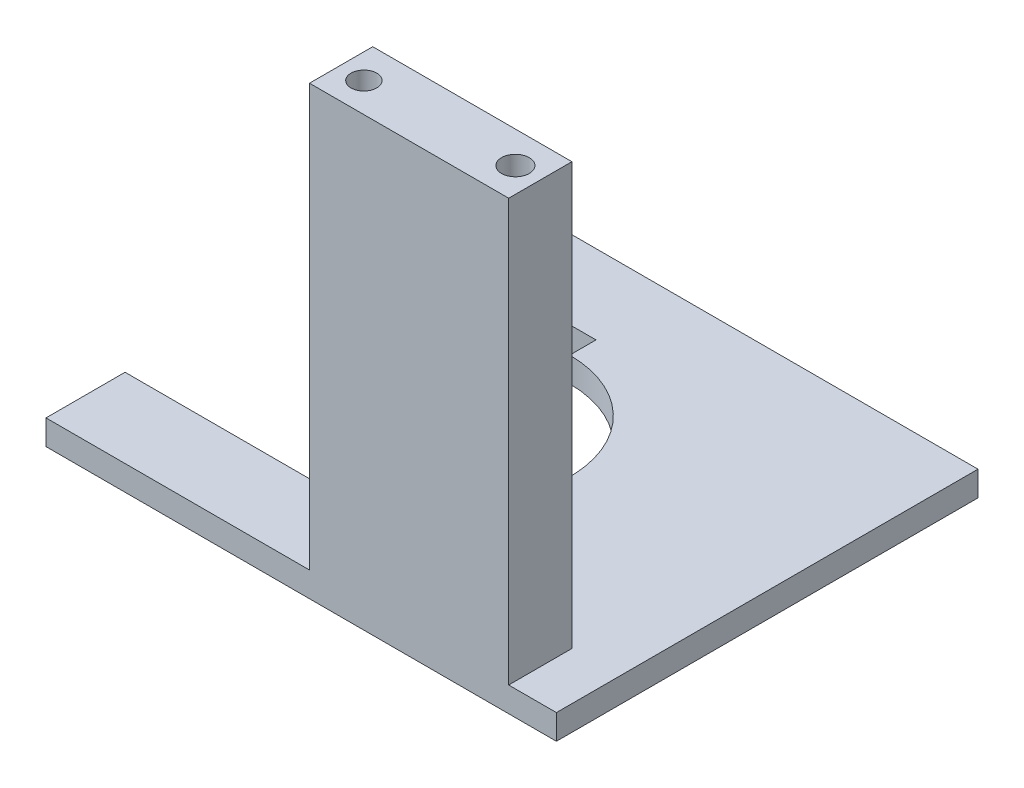
ISO-10303-21;
HEADER;
FILE_DESCRIPTION(('STEP AP214'),'2;1');
FILE_NAME('part.step','',(''),(''),'','','');
FILE_SCHEMA(('AUTOMOTIVE_DESIGN { 1 0 10303 214 1 1 1 1 }'));
ENDSEC;
DATA;
#1=APPLICATION_CONTEXT('core data for automotive mechanical design processes');
#2=APPLICATION_PROTOCOL_DEFINITION('international standard','automotive_design',2000,#1);
#3=PRODUCT_CONTEXT('',#1,'mechanical');
#4=PRODUCT('Part','Part','',(#3));
#5=PRODUCT_RELATED_PRODUCT_CATEGORY('part','',(#4));
#6=PRODUCT_DEFINITION_FORMATION('','',#4);
#7=PRODUCT_DEFINITION_CONTEXT('part definition',#1,'design');
#8=PRODUCT_DEFINITION('design','',#6,#7);
#9=PRODUCT_DEFINITION_SHAPE('','',#8);
#10=(LENGTH_UNIT() NAMED_UNIT(*) SI_UNIT(.MILLI.,.METRE.));
#11=(NAMED_UNIT(*) PLANE_ANGLE_UNIT() SI_UNIT($,.RADIAN.));
#12=(NAMED_UNIT(*) SI_UNIT($,.STERADIAN.) SOLID_ANGLE_UNIT());
#13=UNCERTAINTY_MEASURE_WITH_UNIT(LENGTH_MEASURE(1.E-05),#10,'distance_accuracy_value','');
#14=(GEOMETRIC_REPRESENTATION_CONTEXT(3) GLOBAL_UNCERTAINTY_ASSIGNED_CONTEXT((#13)) GLOBAL_UNIT_ASSIGNED_CONTEXT((#10,
#11,#12)) REPRESENTATION_CONTEXT('',''));
#15=CARTESIAN_POINT('',(0.,0.,0.));
#16=DIRECTION('',(0.,0.,1.));
#17=DIRECTION('',(1.,0.,0.));
#18=AXIS2_PLACEMENT_3D('',#15,#16,#17);
#19=CARTESIAN_POINT('',(0.,3.,0.));
#20=DIRECTION('',(1.,0.,0.));
#21=DIRECTION('',(0.,0.,-1.));
#22=AXIS2_PLACEMENT_3D('',#19,#20,#21);
#23=PLANE('',#22);
#24=DIRECTION('',(0.,0.,1.));
#25=VECTOR('',#24,1.);
#26=CARTESIAN_POINT('',(0.,0.,0.));
#27=LINE('',#26,#25);
#28=CARTESIAN_POINT('',(0.,0.,0.));
#29=VERTEX_POINT('',#28);
#30=CARTESIAN_POINT('',(0.,0.,9.525));
#31=VERTEX_POINT('',#30);
#32=EDGE_CURVE('E170',#29,#31,#27,.T.);
#33=ORIENTED_EDGE('',*,*,#32,.T.);
#34=DIRECTION('',(0.,-1.,0.));
#35=VECTOR('',#34,1.);
#36=CARTESIAN_POINT('',(0.,3.,9.525));
#37=LINE('',#36,#35);
#38=CARTESIAN_POINT('',(0.,3.,9.525));
#39=VERTEX_POINT('',#38);
#40=EDGE_CURVE('E11',#39,#31,#37,.T.);
#41=ORIENTED_EDGE('',*,*,#40,.F.);
#42=DIRECTION('',(0.,0.,1.));
#43=VECTOR('',#42,1.);
#44=CARTESIAN_POINT('',(0.,3.,0.));
#45=LINE('',#44,#43);
#46=CARTESIAN_POINT('',(0.,3.,0.));
#47=VERTEX_POINT('',#46);
#48=EDGE_CURVE('E181',#47,#39,#45,.T.);
#49=ORIENTED_EDGE('',*,*,#48,.F.);
#50=DIRECTION('',(0.,-1.,0.));
#51=VECTOR('',#50,1.);
#52=CARTESIAN_POINT('',(0.,3.,0.));
#53=LINE('',#52,#51);
#54=EDGE_CURVE('E213',#47,#29,#53,.T.);
#55=ORIENTED_EDGE('',*,*,#54,.T.);
#56=EDGE_LOOP('',(#33,#41,#49,#55));
#57=FACE_BOUND('',#56,.T.);
#58=ADVANCED_FACE('F43',(#57),#23,.F.);
#59=CARTESIAN_POINT('',(0.,3.,9.525));
#60=DIRECTION('',(0.,0.,-1.));
#61=DIRECTION('',(-1.,0.,0.));
#62=AXIS2_PLACEMENT_3D('',#59,#60,#61);
#63=PLANE('',#62);
#64=DIRECTION('',(1.,0.,0.));
#65=VECTOR('',#64,1.);
#66=CARTESIAN_POINT('',(0.,0.,9.525));
#67=LINE('',#66,#65);
#68=CARTESIAN_POINT('',(25.,0.,9.525));
#69=VERTEX_POINT('',#68);
#70=EDGE_CURVE('E175',#31,#69,#67,.T.);
#71=ORIENTED_EDGE('',*,*,#70,.T.);
#72=DIRECTION('',(0.,-1.,0.));
#73=VECTOR('',#72,1.);
#74=CARTESIAN_POINT('',(25.,3.,9.525));
#75=LINE('',#74,#73);
#76=CARTESIAN_POINT('',(25.,3.,9.525));
#77=VERTEX_POINT('',#76);
#78=EDGE_CURVE('E51',#77,#69,#75,.T.);
#79=ORIENTED_EDGE('',*,*,#78,.F.);
#80=DIRECTION('',(1.,0.,0.));
#81=VECTOR('',#80,1.);
#82=CARTESIAN_POINT('',(0.,3.,9.525));
#83=LINE('',#82,#81);
#84=EDGE_CURVE('E185',#39,#77,#83,.T.);
#85=ORIENTED_EDGE('',*,*,#84,.F.);
#86=ORIENTED_EDGE('',*,*,#40,.T.);
#87=EDGE_LOOP('',(#71,#79,#85,#86));
#88=FACE_BOUND('',#87,.T.);
#89=ADVANCED_FACE('F298',(#88),#63,.F.);
#90=CARTESIAN_POINT('',(25.,3.,12.7));
#91=DIRECTION('',(1.,0.,0.));
#92=DIRECTION('',(0.,0.,-1.));
#93=AXIS2_PLACEMENT_3D('',#90,#91,#92);
#94=PLANE('',#93);
#95=DIRECTION('',(0.,0.,1.));
#96=VECTOR('',#95,1.);
#97=CARTESIAN_POINT('',(25.,0.,12.7));
#98=LINE('',#97,#96);
#99=CARTESIAN_POINT('',(25.,0.,12.7));
#100=VERTEX_POINT('',#99);
#101=EDGE_CURVE('E217',#69,#100,#98,.T.);
#102=ORIENTED_EDGE('',*,*,#101,.T.);
#103=DIRECTION('',(0.,-1.,0.));
#104=VECTOR('',#103,1.);
#105=CARTESIAN_POINT('',(25.,3.,12.7));
#106=LINE('',#105,#104);
#107=CARTESIAN_POINT('',(25.,3.,12.7));
#108=VERTEX_POINT('',#107);
#109=EDGE_CURVE('E267',#108,#100,#106,.T.);
#110=ORIENTED_EDGE('',*,*,#109,.F.);
#111=DIRECTION('',(0.,0.,1.));
#112=VECTOR('',#111,1.);
#113=CARTESIAN_POINT('',(25.,3.,12.7));
#114=LINE('',#113,#112);
#115=EDGE_CURVE('E189',#77,#108,#114,.T.);
#116=ORIENTED_EDGE('',*,*,#115,.F.);
#117=ORIENTED_EDGE('',*,*,#78,.T.);
#118=EDGE_LOOP('',(#102,#110,#116,#117));
#119=FACE_BOUND('',#118,.T.);
#120=ADVANCED_FACE('F276',(#119),#94,.F.);
#121=CARTESIAN_POINT('',(25.,3.,25.4));
#122=DIRECTION('',(0.,-1.,0.));
#123=DIRECTION('',(0.,0.,-1.));
#124=AXIS2_PLACEMENT_3D('',#121,#122,#123);
#125=CYLINDRICAL_SURFACE('',#124,12.7);
#126=CARTESIAN_POINT('',(25.,0.,25.4));
#127=DIRECTION('',(0.,-1.,0.));
#128=DIRECTION('',(0.,0.,1.));
#129=AXIS2_PLACEMENT_3D('',#126,#127,#128);
#130=CIRCLE('',#129,12.7);
#131=CARTESIAN_POINT('',(25.,0.,38.1));
#132=VERTEX_POINT('',#131);
#133=EDGE_CURVE('E220',#100,#132,#130,.T.);
#134=ORIENTED_EDGE('',*,*,#133,.T.);
#135=DIRECTION('',(0.,-1.,0.));
#136=VECTOR('',#135,1.);
#137=CARTESIAN_POINT('',(25.,3.,38.1));
#138=LINE('',#137,#136);
#139=CARTESIAN_POINT('',(25.,3.,38.1));
#140=VERTEX_POINT('',#139);
#141=EDGE_CURVE('E263',#140,#132,#138,.T.);
#142=ORIENTED_EDGE('',*,*,#141,.F.);
#143=CARTESIAN_POINT('',(25.,3.,25.4));
#144=DIRECTION('',(0.,-1.,0.));
#145=DIRECTION('',(0.,0.,1.));
#146=AXIS2_PLACEMENT_3D('',#143,#144,#145);
#147=CIRCLE('',#146,12.7);
#148=EDGE_CURVE('E192',#108,#140,#147,.T.);
#149=ORIENTED_EDGE('',*,*,#148,.F.);
#150=ORIENTED_EDGE('',*,*,#109,.T.);
#151=EDGE_LOOP('',(#134,#142,#149,#150));
#152=FACE_BOUND('',#151,.T.);
#153=ADVANCED_FACE('F287',(#152),#125,.F.);
#154=CARTESIAN_POINT('',(25.,3.,41.275));
#155=DIRECTION('',(1.,0.,0.));
#156=DIRECTION('',(0.,0.,-1.));
#157=AXIS2_PLACEMENT_3D('',#154,#155,#156);
#158=PLANE('',#157);
#159=DIRECTION('',(0.,0.,1.));
#160=VECTOR('',#159,1.);
#161=CARTESIAN_POINT('',(25.,0.,41.275));
#162=LINE('',#161,#160);
#163=CARTESIAN_POINT('',(25.,0.,41.275));
#164=VERTEX_POINT('',#163);
#165=EDGE_CURVE('E223',#132,#164,#162,.T.);
#166=ORIENTED_EDGE('',*,*,#165,.T.);
#167=DIRECTION('',(0.,-1.,0.));
#168=VECTOR('',#167,1.);
#169=CARTESIAN_POINT('',(25.,3.,41.275));
#170=LINE('',#169,#168);
#171=CARTESIAN_POINT('',(25.,3.,41.275));
#172=VERTEX_POINT('',#171);
#173=EDGE_CURVE('E259',#172,#164,#170,.T.);
#174=ORIENTED_EDGE('',*,*,#173,.F.);
#175=DIRECTION('',(0.,0.,1.));
#176=VECTOR('',#175,1.);
#177=CARTESIAN_POINT('',(25.,3.,41.275));
#178=LINE('',#177,#176);
#179=EDGE_CURVE('E195',#140,#172,#178,.T.);
#180=ORIENTED_EDGE('',*,*,#179,.F.);
#181=ORIENTED_EDGE('',*,*,#141,.T.);
#182=EDGE_LOOP('',(#166,#174,#180,#181));
#183=FACE_BOUND('',#182,.T.);
#184=ADVANCED_FACE('F291',(#183),#158,.F.);
#185=CARTESIAN_POINT('',(0.,3.,41.275));
#186=DIRECTION('',(0.,0.,1.));
#187=DIRECTION('',(1.,0.,0.));
#188=AXIS2_PLACEMENT_3D('',#185,#186,#187);
#189=PLANE('',#188);
#190=DIRECTION('',(-1.,0.,0.));
#191=VECTOR('',#190,1.);
#192=CARTESIAN_POINT('',(0.,0.,41.275));
#193=LINE('',#192,#191);
#194=CARTESIAN_POINT('',(0.,0.,41.275));
#195=VERTEX_POINT('',#194);
#196=EDGE_CURVE('E226',#164,#195,#193,.T.);
#197=ORIENTED_EDGE('',*,*,#196,.T.);
#198=DIRECTION('',(0.,-1.,0.));
#199=VECTOR('',#198,1.);
#200=CARTESIAN_POINT('',(0.,3.,41.275));
#201=LINE('',#200,#199);
#202=CARTESIAN_POINT('',(0.,3.,41.275));
#203=VERTEX_POINT('',#202);
#204=EDGE_CURVE('E255',#203,#195,#201,.T.);
#205=ORIENTED_EDGE('',*,*,#204,.F.);
#206=DIRECTION('',(-1.,0.,0.));
#207=VECTOR('',#206,1.);
#208=CARTESIAN_POINT('',(0.,3.,41.275));
#209=LINE('',#208,#207);
#210=EDGE_CURVE('E198',#172,#203,#209,.T.);
#211=ORIENTED_EDGE('',*,*,#210,.F.);
#212=ORIENTED_EDGE('',*,*,#173,.T.);
#213=EDGE_LOOP('',(#197,#205,#211,#212));
#214=FACE_BOUND('',#213,.T.);
#215=ADVANCED_FACE('F318',(#214),#189,.F.);
#216=CARTESIAN_POINT('',(0.,3.,41.275));
#217=DIRECTION('',(1.,0.,0.));
#218=DIRECTION('',(0.,0.,-1.));
#219=AXIS2_PLACEMENT_3D('',#216,#217,#218);
#220=PLANE('',#219);
#221=DIRECTION('',(0.,0.,1.));
#222=VECTOR('',#221,1.);
#223=CARTESIAN_POINT('',(0.,0.,41.275));
#224=LINE('',#223,#222);
#225=CARTESIAN_POINT('',(0.,0.,50.8));
#226=VERTEX_POINT('',#225);
#227=EDGE_CURVE('E229',#195,#226,#224,.T.);
#228=ORIENTED_EDGE('',*,*,#227,.T.);
#229=DIRECTION('',(0.,-1.,0.));
#230=VECTOR('',#229,1.);
#231=CARTESIAN_POINT('',(0.,3.,50.8));
#232=LINE('',#231,#230);
#233=CARTESIAN_POINT('',(0.,3.,50.8));
#234=VERTEX_POINT('',#233);
#235=EDGE_CURVE('E251',#234,#226,#232,.T.);
#236=ORIENTED_EDGE('',*,*,#235,.F.);
#237=DIRECTION('',(0.,0.,1.));
#238=VECTOR('',#237,1.);
#239=CARTESIAN_POINT('',(0.,3.,41.275));
#240=LINE('',#239,#238);
#241=EDGE_CURVE('E201',#203,#234,#240,.T.);
#242=ORIENTED_EDGE('',*,*,#241,.F.);
#243=ORIENTED_EDGE('',*,*,#204,.T.);
#244=EDGE_LOOP('',(#228,#236,#242,#243));
#245=FACE_BOUND('',#244,.T.);
#246=ADVANCED_FACE('F315',(#245),#220,.F.);
#247=CARTESIAN_POINT('',(0.,3.,50.8));
#248=DIRECTION('',(0.,0.,-1.));
#249=DIRECTION('',(-1.,0.,0.));
#250=AXIS2_PLACEMENT_3D('',#247,#248,#249);
#251=PLANE('',#250);
#252=DIRECTION('',(1.,0.,0.));
#253=VECTOR('',#252,1.);
#254=CARTESIAN_POINT('',(0.,0.,50.8));
#255=LINE('',#254,#253);
#256=CARTESIAN_POINT('',(61.5,0.,50.8));
#257=VERTEX_POINT('',#256);
#258=EDGE_CURVE('E232',#226,#257,#255,.T.);
#259=ORIENTED_EDGE('',*,*,#258,.T.);
#260=DIRECTION('',(0.,-1.,0.));
#261=VECTOR('',#260,1.);
#262=CARTESIAN_POINT('',(61.5,3.,50.8));
#263=LINE('',#262,#261);
#264=CARTESIAN_POINT('',(61.5,3.,50.8));
#265=VERTEX_POINT('',#264);
#266=EDGE_CURVE('E247',#265,#257,#263,.T.);
#267=ORIENTED_EDGE('',*,*,#266,.F.);
#268=DIRECTION('',(1.,0.,0.));
#269=VECTOR('',#268,1.);
#270=CARTESIAN_POINT('',(0.,3.,50.8));
#271=LINE('',#270,#269);
#272=CARTESIAN_POINT('',(55.75,3.,50.8));
#273=VERTEX_POINT('',#272);
#274=EDGE_CURVE('E204',#273,#265,#271,.T.);
#275=ORIENTED_EDGE('',*,*,#274,.F.);
#276=DIRECTION('',(0.,-1.,0.));
#277=VECTOR('',#276,1.);
#278=CARTESIAN_POINT('',(55.75,53.8,50.8));
#279=LINE('',#278,#277);
#280=CARTESIAN_POINT('',(55.75,53.8,50.8));
#281=VERTEX_POINT('',#280);
#282=EDGE_CURVE('E150',#281,#273,#279,.T.);
#283=ORIENTED_EDGE('',*,*,#282,.F.);
#284=DIRECTION('',(1.,0.,0.));
#285=VECTOR('',#284,1.);
#286=CARTESIAN_POINT('',(31.75,53.8,50.8));
#287=LINE('',#286,#285);
#288=CARTESIAN_POINT('',(31.75,53.8,50.8));
#289=VERTEX_POINT('',#288);
#290=EDGE_CURVE('E143',#289,#281,#287,.T.);
#291=ORIENTED_EDGE('',*,*,#290,.F.);
#292=DIRECTION('',(0.,-1.,0.));
#293=VECTOR('',#292,1.);
#294=CARTESIAN_POINT('',(31.75,53.8,50.8));
#295=LINE('',#294,#293);
#296=CARTESIAN_POINT('',(31.75,3.,50.8));
#297=VERTEX_POINT('',#296);
#298=EDGE_CURVE('E148',#289,#297,#295,.T.);
#299=ORIENTED_EDGE('',*,*,#298,.T.);
#300=EDGE_CURVE('E205',#234,#297,#271,.T.);
#301=ORIENTED_EDGE('',*,*,#300,.F.);
#302=ORIENTED_EDGE('',*,*,#235,.T.);
#303=EDGE_LOOP('',(#259,#267,#275,#283,#291,#299,#301,#302));
#304=FACE_BOUND('',#303,.T.);
#305=ADVANCED_FACE('F145',(#304),#251,.F.);
#306=CARTESIAN_POINT('',(61.5,3.,0.));
#307=DIRECTION('',(-1.,0.,0.));
#308=DIRECTION('',(0.,0.,1.));
#309=AXIS2_PLACEMENT_3D('',#306,#307,#308);
#310=PLANE('',#309);
#311=DIRECTION('',(0.,0.,-1.));
#312=VECTOR('',#311,1.);
#313=CARTESIAN_POINT('',(61.5,0.,0.));
#314=LINE('',#313,#312);
#315=CARTESIAN_POINT('',(61.5,0.,0.));
#316=VERTEX_POINT('',#315);
#317=EDGE_CURVE('E235',#257,#316,#314,.T.);
#318=ORIENTED_EDGE('',*,*,#317,.T.);
#319=DIRECTION('',(0.,-1.,0.));
#320=VECTOR('',#319,1.);
#321=CARTESIAN_POINT('',(61.5,3.,0.));
#322=LINE('',#321,#320);
#323=CARTESIAN_POINT('',(61.5,3.,0.));
#324=VERTEX_POINT('',#323);
#325=EDGE_CURVE('E243',#324,#316,#322,.T.);
#326=ORIENTED_EDGE('',*,*,#325,.F.);
#327=DIRECTION('',(0.,0.,-1.));
#328=VECTOR('',#327,1.);
#329=CARTESIAN_POINT('',(61.5,3.,0.));
#330=LINE('',#329,#328);
#331=EDGE_CURVE('E208',#265,#324,#330,.T.);
#332=ORIENTED_EDGE('',*,*,#331,.F.);
#333=ORIENTED_EDGE('',*,*,#266,.T.);
#334=EDGE_LOOP('',(#318,#326,#332,#333));
#335=FACE_BOUND('',#334,.T.);
#336=ADVANCED_FACE('F310',(#335),#310,.F.);
#337=CARTESIAN_POINT('',(0.,3.,0.));
#338=DIRECTION('',(0.,0.,1.));
#339=DIRECTION('',(1.,0.,0.));
#340=AXIS2_PLACEMENT_3D('',#337,#338,#339);
#341=PLANE('',#340);
#342=DIRECTION('',(-1.,0.,0.));
#343=VECTOR('',#342,1.);
#344=CARTESIAN_POINT('',(0.,0.,0.));
#345=LINE('',#344,#343);
#346=EDGE_CURVE('E186',#316,#29,#345,.T.);
#347=ORIENTED_EDGE('',*,*,#346,.T.);
#348=ORIENTED_EDGE('',*,*,#54,.F.);
#349=DIRECTION('',(-1.,0.,0.));
#350=VECTOR('',#349,1.);
#351=CARTESIAN_POINT('',(0.,3.,0.));
#352=LINE('',#351,#350);
#353=EDGE_CURVE('E211',#324,#47,#352,.T.);
#354=ORIENTED_EDGE('',*,*,#353,.F.);
#355=ORIENTED_EDGE('',*,*,#325,.T.);
#356=EDGE_LOOP('',(#347,#348,#354,#355));
#357=FACE_BOUND('',#356,.T.);
#358=ADVANCED_FACE('F305',(#357),#341,.F.);
#359=CARTESIAN_POINT('',(25.,3.,25.4));
#360=DIRECTION('',(0.,1.,0.));
#361=DIRECTION('',(0.,0.,1.));
#362=AXIS2_PLACEMENT_3D('',#359,#360,#361);
#363=PLANE('',#362);
#364=DIRECTION('',(0.,0.,1.));
#365=VECTOR('',#364,1.);
#366=CARTESIAN_POINT('',(31.75,3.,50.8));
#367=LINE('',#366,#365);
#368=CARTESIAN_POINT('',(31.75,3.,43.18));
#369=VERTEX_POINT('',#368);
#370=EDGE_CURVE('E58',#369,#297,#367,.T.);
#371=ORIENTED_EDGE('',*,*,#370,.F.);
#372=DIRECTION('',(-1.,0.,0.));
#373=VECTOR('',#372,1.);
#374=CARTESIAN_POINT('',(31.75,3.,43.18));
#375=LINE('',#374,#373);
#376=CARTESIAN_POINT('',(55.75,3.,43.18));
#377=VERTEX_POINT('',#376);
#378=EDGE_CURVE('E166',#377,#369,#375,.T.);
#379=ORIENTED_EDGE('',*,*,#378,.F.);
#380=DIRECTION('',(0.,0.,-1.));
#381=VECTOR('',#380,1.);
#382=CARTESIAN_POINT('',(55.75,3.,50.8));
#383=LINE('',#382,#381);
#384=EDGE_CURVE('E64',#273,#377,#383,.T.);
#385=ORIENTED_EDGE('',*,*,#384,.F.);
#386=ORIENTED_EDGE('',*,*,#274,.T.);
#387=ORIENTED_EDGE('',*,*,#331,.T.);
#388=ORIENTED_EDGE('',*,*,#353,.T.);
#389=ORIENTED_EDGE('',*,*,#48,.T.);
#390=ORIENTED_EDGE('',*,*,#84,.T.);
#391=ORIENTED_EDGE('',*,*,#115,.T.);
#392=ORIENTED_EDGE('',*,*,#148,.T.);
#393=ORIENTED_EDGE('',*,*,#179,.T.);
#394=ORIENTED_EDGE('',*,*,#210,.T.);
#395=ORIENTED_EDGE('',*,*,#241,.T.);
#396=ORIENTED_EDGE('',*,*,#300,.T.);
#397=EDGE_LOOP('',(#371,#379,#385,#386,#387,#388,#389,#390,#391,#392,#393,#394,#395,#396));
#398=FACE_BOUND('',#397,.T.);
#399=ADVANCED_FACE('F294',(#398),#363,.T.);
#400=CARTESIAN_POINT('',(25.,0.,25.4));
#401=DIRECTION('',(0.,1.,0.));
#402=DIRECTION('',(0.,0.,1.));
#403=AXIS2_PLACEMENT_3D('',#400,#401,#402);
#404=PLANE('',#403);
#405=ORIENTED_EDGE('',*,*,#32,.F.);
#406=ORIENTED_EDGE('',*,*,#346,.F.);
#407=ORIENTED_EDGE('',*,*,#317,.F.);
#408=ORIENTED_EDGE('',*,*,#258,.F.);
#409=ORIENTED_EDGE('',*,*,#227,.F.);
#410=ORIENTED_EDGE('',*,*,#196,.F.);
#411=ORIENTED_EDGE('',*,*,#165,.F.);
#412=ORIENTED_EDGE('',*,*,#133,.F.);
#413=ORIENTED_EDGE('',*,*,#101,.F.);
#414=ORIENTED_EDGE('',*,*,#70,.F.);
#415=EDGE_LOOP('',(#405,#406,#407,#408,#409,#410,#411,#412,#413,#414));
#416=FACE_BOUND('',#415,.T.);
#417=ADVANCED_FACE('F282',(#416),#404,.F.);
#418=CARTESIAN_POINT('',(0.,53.8,0.));
#419=DIRECTION('',(0.,-1.,0.));
#420=DIRECTION('',(0.,0.,-1.));
#421=AXIS2_PLACEMENT_3D('',#418,#419,#420);
#422=PLANE('',#421);
#423=DIRECTION('',(0.,0.,1.));
#424=VECTOR('',#423,1.);
#425=CARTESIAN_POINT('',(31.75,53.8,50.8));
#426=LINE('',#425,#424);
#427=CARTESIAN_POINT('',(31.75,53.8,43.18));
#428=VERTEX_POINT('',#427);
#429=EDGE_CURVE('E155',#428,#289,#426,.T.);
#430=ORIENTED_EDGE('',*,*,#429,.T.);
#431=ORIENTED_EDGE('',*,*,#290,.T.);
#432=DIRECTION('',(0.,0.,-1.));
#433=VECTOR('',#432,1.);
#434=CARTESIAN_POINT('',(55.75,53.8,50.8));
#435=LINE('',#434,#433);
#436=CARTESIAN_POINT('',(55.75,53.8,43.18));
#437=VERTEX_POINT('',#436);
#438=EDGE_CURVE('E154',#281,#437,#435,.T.);
#439=ORIENTED_EDGE('',*,*,#438,.T.);
#440=DIRECTION('',(-1.,0.,0.));
#441=VECTOR('',#440,1.);
#442=CARTESIAN_POINT('',(31.75,53.8,43.18));
#443=LINE('',#442,#441);
#444=EDGE_CURVE('E161',#437,#428,#443,.T.);
#445=ORIENTED_EDGE('',*,*,#444,.T.);
#446=EDGE_LOOP('',(#430,#431,#439,#445));
#447=FACE_BOUND('',#446,.T.);
#448=CARTESIAN_POINT('',(34.75,53.8,47.2451422615383));
#449=DIRECTION('',(0.,1.,0.));
#450=DIRECTION('',(0.,0.,1.));
#451=AXIS2_PLACEMENT_3D('',#448,#449,#450);
#452=CIRCLE('',#451,1.55159703814056);
#453=CARTESIAN_POINT('',(34.75,53.8,48.7967392996789));
#454=VERTEX_POINT('',#453);
#455=EDGE_CURVE('E554',#454,#454,#452,.T.);
#456=ORIENTED_EDGE('',*,*,#455,.F.);
#457=EDGE_LOOP('',(#456));
#458=FACE_BOUND('',#457,.T.);
#459=CARTESIAN_POINT('',(52.7481916432284,53.8,46.99));
#460=DIRECTION('',(0.,1.,0.));
#461=DIRECTION('',(0.,0.,1.));
#462=AXIS2_PLACEMENT_3D('',#459,#460,#461);
#463=CIRCLE('',#462,1.6644542389572);
#464=CARTESIAN_POINT('',(52.7481916432284,53.8,48.6544542389572));
#465=VERTEX_POINT('',#464);
#466=EDGE_CURVE('E547',#465,#465,#463,.T.);
#467=ORIENTED_EDGE('',*,*,#466,.F.);
#468=EDGE_LOOP('',(#467));
#469=FACE_BOUND('',#468,.T.);
#470=ADVANCED_FACE('F158',(#447,#458,#469),#422,.F.);
#471=CARTESIAN_POINT('',(31.75,53.8,50.8));
#472=DIRECTION('',(1.,0.,0.));
#473=DIRECTION('',(0.,0.,-1.));
#474=AXIS2_PLACEMENT_3D('',#471,#472,#473);
#475=PLANE('',#474);
#476=ORIENTED_EDGE('',*,*,#370,.T.);
#477=ORIENTED_EDGE('',*,*,#298,.F.);
#478=ORIENTED_EDGE('',*,*,#429,.F.);
#479=DIRECTION('',(0.,-1.,0.));
#480=VECTOR('',#479,1.);
#481=CARTESIAN_POINT('',(31.75,53.8,43.18));
#482=LINE('',#481,#480);
#483=EDGE_CURVE('E565',#428,#369,#482,.T.);
#484=ORIENTED_EDGE('',*,*,#483,.T.);
#485=EDGE_LOOP('',(#476,#477,#478,#484));
#486=FACE_BOUND('',#485,.T.);
#487=ADVANCED_FACE('F168',(#486),#475,.F.);
#488=CARTESIAN_POINT('',(55.75,53.8,50.8));
#489=DIRECTION('',(-1.,0.,0.));
#490=DIRECTION('',(0.,0.,1.));
#491=AXIS2_PLACEMENT_3D('',#488,#489,#490);
#492=PLANE('',#491);
#493=ORIENTED_EDGE('',*,*,#384,.T.);
#494=DIRECTION('',(0.,-1.,0.));
#495=VECTOR('',#494,1.);
#496=CARTESIAN_POINT('',(55.75,53.8,43.18));
#497=LINE('',#496,#495);
#498=EDGE_CURVE('E177',#437,#377,#497,.T.);
#499=ORIENTED_EDGE('',*,*,#498,.F.);
#500=ORIENTED_EDGE('',*,*,#438,.F.);
#501=ORIENTED_EDGE('',*,*,#282,.T.);
#502=EDGE_LOOP('',(#493,#499,#500,#501));
#503=FACE_BOUND('',#502,.T.);
#504=ADVANCED_FACE('F425',(#503),#492,.F.);
#505=CARTESIAN_POINT('',(31.75,53.8,43.18));
#506=DIRECTION('',(0.,0.,1.));
#507=DIRECTION('',(1.,0.,0.));
#508=AXIS2_PLACEMENT_3D('',#505,#506,#507);
#509=PLANE('',#508);
#510=ORIENTED_EDGE('',*,*,#378,.T.);
#511=ORIENTED_EDGE('',*,*,#483,.F.);
#512=ORIENTED_EDGE('',*,*,#444,.F.);
#513=ORIENTED_EDGE('',*,*,#498,.T.);
#514=EDGE_LOOP('',(#510,#511,#512,#513));
#515=FACE_BOUND('',#514,.T.);
#516=ADVANCED_FACE('F435',(#515),#509,.F.);
#517=CARTESIAN_POINT('',(34.75,53.8,47.2451422615383));
#518=DIRECTION('',(0.,-1.,0.));
#519=DIRECTION('',(0.,0.,-1.));
#520=AXIS2_PLACEMENT_3D('',#517,#518,#519);
#521=CYLINDRICAL_SURFACE('',#520,1.55159703814056);
#522=ORIENTED_EDGE('',*,*,#455,.T.);
#523=EDGE_LOOP('',(#522));
#524=FACE_BOUND('',#523,.T.);
#525=CARTESIAN_POINT('',(34.75,3.,47.2451422615383));
#526=DIRECTION('',(0.,1.,0.));
#527=DIRECTION('',(0.,0.,1.));
#528=AXIS2_PLACEMENT_3D('',#525,#526,#527);
#529=CIRCLE('',#528,1.55159703814056);
#530=CARTESIAN_POINT('',(34.75,3.,48.7967392996789));
#531=VERTEX_POINT('',#530);
#532=EDGE_CURVE('E551',#531,#531,#529,.T.);
#533=ORIENTED_EDGE('',*,*,#532,.F.);
#534=EDGE_LOOP('',(#533));
#535=FACE_BOUND('',#534,.T.);
#536=ADVANCED_FACE('F446',(#524,#535),#521,.F.);
#537=CARTESIAN_POINT('',(52.7481916432284,53.8,46.99));
#538=DIRECTION('',(0.,-1.,0.));
#539=DIRECTION('',(0.,0.,-1.));
#540=AXIS2_PLACEMENT_3D('',#537,#538,#539);
#541=CYLINDRICAL_SURFACE('',#540,1.6644542389572);
#542=ORIENTED_EDGE('',*,*,#466,.T.);
#543=EDGE_LOOP('',(#542));
#544=FACE_BOUND('',#543,.T.);
#545=CARTESIAN_POINT('',(52.7481916432284,3.,46.99));
#546=DIRECTION('',(0.,1.,0.));
#547=DIRECTION('',(0.,0.,1.));
#548=AXIS2_PLACEMENT_3D('',#545,#546,#547);
#549=CIRCLE('',#548,1.6644542389572);
#550=CARTESIAN_POINT('',(52.7481916432284,3.,48.6544542389572));
#551=VERTEX_POINT('',#550);
#552=EDGE_CURVE('E544',#551,#551,#549,.T.);
#553=ORIENTED_EDGE('',*,*,#552,.F.);
#554=EDGE_LOOP('',(#553));
#555=FACE_BOUND('',#554,.T.);
#556=ADVANCED_FACE('F457',(#544,#555),#541,.F.);
#557=ORIENTED_EDGE('',*,*,#532,.T.);
#558=EDGE_LOOP('',(#557));
#559=FACE_BOUND('',#558,.T.);
#560=ADVANCED_FACE('F409',(#559),#363,.T.);
#561=ORIENTED_EDGE('',*,*,#552,.T.);
#562=EDGE_LOOP('',(#561));
#563=FACE_BOUND('',#562,.T.);
#564=ADVANCED_FACE('F410',(#563),#363,.T.);
#565=CLOSED_SHELL('',(#58,#89,#120,#153,#184,#215,#246,#305,#336,#358,#399,#417,#470,#487,#504,
#516,#536,#556,#560,#564));
#566=MANIFOLD_SOLID_BREP('B2',#565);
#567=ADVANCED_BREP_SHAPE_REPRESENTATION('',(#18,#566),#14);
#568=SHAPE_DEFINITION_REPRESENTATION(#9,#567);
ENDSEC;
END-ISO-10303-21;
